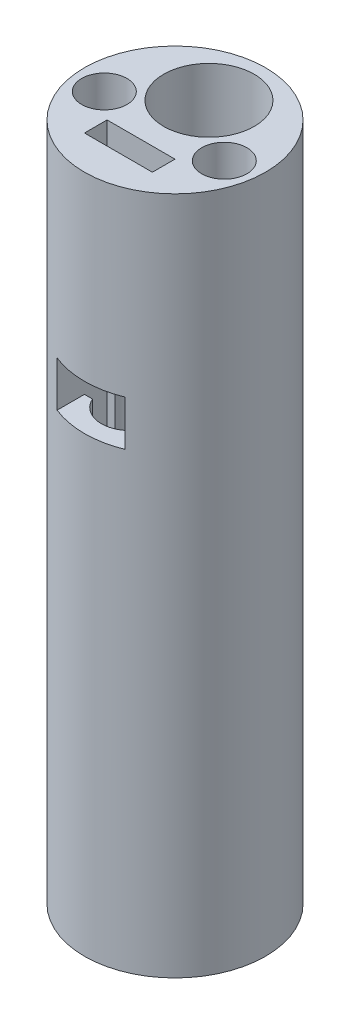
ISO-10303-21;
HEADER;
FILE_DESCRIPTION(('STEP AP214'),'2;1');
FILE_NAME('part.step','',(''),(''),'','','');
FILE_SCHEMA(('AUTOMOTIVE_DESIGN { 1 0 10303 214 1 1 1 1 }'));
ENDSEC;
DATA;
#1=APPLICATION_CONTEXT('core data for automotive mechanical design processes');
#2=APPLICATION_PROTOCOL_DEFINITION('international standard','automotive_design',2000,#1);
#3=PRODUCT_CONTEXT('',#1,'mechanical');
#4=PRODUCT('Part','Part','',(#3));
#5=PRODUCT_RELATED_PRODUCT_CATEGORY('part','',(#4));
#6=PRODUCT_DEFINITION_FORMATION('','',#4);
#7=PRODUCT_DEFINITION_CONTEXT('part definition',#1,'design');
#8=PRODUCT_DEFINITION('design','',#6,#7);
#9=PRODUCT_DEFINITION_SHAPE('','',#8);
#10=(LENGTH_UNIT() NAMED_UNIT(*) SI_UNIT(.MILLI.,.METRE.));
#11=(NAMED_UNIT(*) PLANE_ANGLE_UNIT() SI_UNIT($,.RADIAN.));
#12=(NAMED_UNIT(*) SI_UNIT($,.STERADIAN.) SOLID_ANGLE_UNIT());
#13=UNCERTAINTY_MEASURE_WITH_UNIT(LENGTH_MEASURE(1.E-05),#10,'distance_accuracy_value','');
#14=(GEOMETRIC_REPRESENTATION_CONTEXT(3) GLOBAL_UNCERTAINTY_ASSIGNED_CONTEXT((#13)) GLOBAL_UNIT_ASSIGNED_CONTEXT((#10,
#11,#12)) REPRESENTATION_CONTEXT('',''));
#15=CARTESIAN_POINT('',(0.,0.,0.));
#16=DIRECTION('',(0.,0.,1.));
#17=DIRECTION('',(1.,0.,0.));
#18=AXIS2_PLACEMENT_3D('',#15,#16,#17);
#19=CARTESIAN_POINT('',(0.,17.,0.));
#20=DIRECTION('',(0.,1.,0.));
#21=DIRECTION('',(0.,0.,1.));
#22=AXIS2_PLACEMENT_3D('',#19,#20,#21);
#23=PLANE('',#22);
#24=CARTESIAN_POINT('',(0.,17.,2.));
#25=DIRECTION('',(0.,1.,0.));
#26=DIRECTION('',(0.,0.,1.));
#27=AXIS2_PLACEMENT_3D('',#24,#25,#26);
#28=CIRCLE('',#27,1.25);
#29=CARTESIAN_POINT('',(1.14564392373896,17.,2.5));
#30=VERTEX_POINT('',#29);
#31=CARTESIAN_POINT('',(1.14564392373896,17.,1.5));
#32=VERTEX_POINT('',#31);
#33=EDGE_CURVE('E57',#30,#32,#28,.T.);
#34=ORIENTED_EDGE('',*,*,#33,.F.);
#35=DIRECTION('',(1.,0.,0.));
#36=VECTOR('',#35,1.);
#37=CARTESIAN_POINT('',(0.,17.,2.5));
#38=LINE('',#37,#36);
#39=CARTESIAN_POINT('',(1.5,17.,2.5));
#40=VERTEX_POINT('',#39);
#41=EDGE_CURVE('E180',#30,#40,#38,.T.);
#42=ORIENTED_EDGE('',*,*,#41,.T.);
#43=DIRECTION('',(0.,0.,-1.));
#44=VECTOR('',#43,1.);
#45=CARTESIAN_POINT('',(1.5,17.,0.));
#46=LINE('',#45,#44);
#47=CARTESIAN_POINT('',(1.5,17.,1.5));
#48=VERTEX_POINT('',#47);
#49=EDGE_CURVE('E202',#40,#48,#46,.T.);
#50=ORIENTED_EDGE('',*,*,#49,.T.);
#51=DIRECTION('',(1.,0.,0.));
#52=VECTOR('',#51,1.);
#53=CARTESIAN_POINT('',(0.,17.,1.5));
#54=LINE('',#53,#52);
#55=EDGE_CURVE('E181',#32,#48,#54,.T.);
#56=ORIENTED_EDGE('',*,*,#55,.F.);
#57=EDGE_LOOP('',(#34,#42,#50,#56));
#58=FACE_BOUND('',#57,.T.);
#59=ADVANCED_FACE('F45',(#58),#23,.T.);
#60=CARTESIAN_POINT('',(0.,20.,0.));
#61=DIRECTION('',(0.,-1.,0.));
#62=DIRECTION('',(0.,0.,-1.));
#63=AXIS2_PLACEMENT_3D('',#60,#61,#62);
#64=PLANE('',#63);
#65=DIRECTION('',(1.,0.,0.));
#66=VECTOR('',#65,1.);
#67=CARTESIAN_POINT('',(-1.5,20.,1.));
#68=LINE('',#67,#66);
#69=CARTESIAN_POINT('',(0.75,20.,1.));
#70=VERTEX_POINT('',#69);
#71=CARTESIAN_POINT('',(1.5,20.,1.));
#72=VERTEX_POINT('',#71);
#73=EDGE_CURVE('E268',#70,#72,#68,.T.);
#74=ORIENTED_EDGE('',*,*,#73,.F.);
#75=CARTESIAN_POINT('',(0.,20.,2.));
#76=DIRECTION('',(0.,1.,0.));
#77=DIRECTION('',(0.,0.,1.));
#78=AXIS2_PLACEMENT_3D('',#75,#76,#77);
#79=CIRCLE('',#78,1.25);
#80=CARTESIAN_POINT('',(1.14564392373896,20.,1.5));
#81=VERTEX_POINT('',#80);
#82=EDGE_CURVE('E65',#81,#70,#79,.T.);
#83=ORIENTED_EDGE('',*,*,#82,.F.);
#84=DIRECTION('',(1.,0.,0.));
#85=VECTOR('',#84,1.);
#86=CARTESIAN_POINT('',(0.,20.,1.5));
#87=LINE('',#86,#85);
#88=CARTESIAN_POINT('',(1.5,20.,1.5));
#89=VERTEX_POINT('',#88);
#90=EDGE_CURVE('E235',#81,#89,#87,.T.);
#91=ORIENTED_EDGE('',*,*,#90,.T.);
#92=DIRECTION('',(0.,0.,-1.));
#93=VECTOR('',#92,1.);
#94=CARTESIAN_POINT('',(1.5,20.,2.5));
#95=LINE('',#94,#93);
#96=EDGE_CURVE('E329',#89,#72,#95,.T.);
#97=ORIENTED_EDGE('',*,*,#96,.T.);
#98=EDGE_LOOP('',(#74,#83,#91,#97));
#99=FACE_BOUND('',#98,.T.);
#100=ADVANCED_FACE('F387',(#99),#64,.F.);
#101=CARTESIAN_POINT('',(1.5,20.,3.70809924354783));
#102=VERTEX_POINT('',#101);
#103=CARTESIAN_POINT('',(1.5,20.,2.5));
#104=VERTEX_POINT('',#103);
#105=EDGE_CURVE('E325',#102,#104,#95,.T.);
#106=ORIENTED_EDGE('',*,*,#105,.T.);
#107=DIRECTION('',(1.,0.,0.));
#108=VECTOR('',#107,1.);
#109=CARTESIAN_POINT('',(0.,20.,2.5));
#110=LINE('',#109,#108);
#111=CARTESIAN_POINT('',(1.14564392373896,20.,2.5));
#112=VERTEX_POINT('',#111);
#113=EDGE_CURVE('E232',#112,#104,#110,.T.);
#114=ORIENTED_EDGE('',*,*,#113,.F.);
#115=CARTESIAN_POINT('',(0.,20.,2.));
#116=DIRECTION('',(0.,1.,0.));
#117=DIRECTION('',(0.,0.,1.));
#118=AXIS2_PLACEMENT_3D('',#115,#116,#117);
#119=CIRCLE('',#118,1.25);
#120=CARTESIAN_POINT('',(-1.14564392373896,20.,2.5));
#121=VERTEX_POINT('',#120);
#122=EDGE_CURVE('E191',#121,#112,#119,.T.);
#123=ORIENTED_EDGE('',*,*,#122,.F.);
#124=DIRECTION('',(1.,0.,0.));
#125=VECTOR('',#124,1.);
#126=CARTESIAN_POINT('',(0.,20.,2.5));
#127=LINE('',#126,#125);
#128=CARTESIAN_POINT('',(-1.5,20.,2.5));
#129=VERTEX_POINT('',#128);
#130=EDGE_CURVE('E226',#129,#121,#127,.T.);
#131=ORIENTED_EDGE('',*,*,#130,.F.);
#132=DIRECTION('',(0.,0.,1.));
#133=VECTOR('',#132,1.);
#134=CARTESIAN_POINT('',(-1.5,20.,2.5));
#135=LINE('',#134,#133);
#136=CARTESIAN_POINT('',(-1.5,20.,3.70809924354783));
#137=VERTEX_POINT('',#136);
#138=EDGE_CURVE('E73',#129,#137,#135,.T.);
#139=ORIENTED_EDGE('',*,*,#138,.T.);
#140=CARTESIAN_POINT('',(0.,20.,0.));
#141=DIRECTION('',(0.,-1.,0.));
#142=DIRECTION('',(0.,0.,-1.));
#143=AXIS2_PLACEMENT_3D('',#140,#141,#142);
#144=CIRCLE('',#143,4.);
#145=EDGE_CURVE('E298',#102,#137,#144,.T.);
#146=ORIENTED_EDGE('',*,*,#145,.F.);
#147=EDGE_LOOP('',(#106,#114,#123,#131,#139,#146));
#148=FACE_BOUND('',#147,.T.);
#149=ADVANCED_FACE('F395',(#148),#64,.F.);
#150=CARTESIAN_POINT('',(0.,30.,0.));
#151=DIRECTION('',(0.,-1.,0.));
#152=DIRECTION('',(0.,0.,-1.));
#153=AXIS2_PLACEMENT_3D('',#150,#151,#152);
#154=CYLINDRICAL_SURFACE('',#153,4.);
#155=CARTESIAN_POINT('',(0.,22.,0.));
#156=DIRECTION('',(0.,1.,0.));
#157=DIRECTION('',(0.,0.,1.));
#158=AXIS2_PLACEMENT_3D('',#155,#156,#157);
#159=CIRCLE('',#158,4.);
#160=CARTESIAN_POINT('',(-1.5,22.,3.70809924354783));
#161=VERTEX_POINT('',#160);
#162=CARTESIAN_POINT('',(1.5,22.,3.70809924354783));
#163=VERTEX_POINT('',#162);
#164=EDGE_CURVE('E308',#161,#163,#159,.T.);
#165=ORIENTED_EDGE('',*,*,#164,.T.);
#166=DIRECTION('',(0.,-1.,0.));
#167=VECTOR('',#166,1.);
#168=CARTESIAN_POINT('',(1.5,30.,3.70809924354783));
#169=LINE('',#168,#167);
#170=EDGE_CURVE('E312',#163,#102,#169,.T.);
#171=ORIENTED_EDGE('',*,*,#170,.T.);
#172=ORIENTED_EDGE('',*,*,#145,.T.);
#173=DIRECTION('',(0.,-1.,0.));
#174=VECTOR('',#173,1.);
#175=CARTESIAN_POINT('',(-1.5,30.,3.70809924354783));
#176=LINE('',#175,#174);
#177=EDGE_CURVE('E304',#137,#161,#176,.F.);
#178=ORIENTED_EDGE('',*,*,#177,.T.);
#179=EDGE_LOOP('',(#165,#171,#172,#178));
#180=FACE_BOUND('',#179,.T.);
#181=CARTESIAN_POINT('',(0.,30.,0.));
#182=DIRECTION('',(0.,1.,0.));
#183=DIRECTION('',(0.,0.,1.));
#184=AXIS2_PLACEMENT_3D('',#181,#182,#183);
#185=CIRCLE('',#184,4.);
#186=CARTESIAN_POINT('',(0.,30.,4.));
#187=VERTEX_POINT('',#186);
#188=EDGE_CURVE('E55',#187,#187,#185,.T.);
#189=ORIENTED_EDGE('',*,*,#188,.F.);
#190=EDGE_LOOP('',(#189));
#191=FACE_BOUND('',#190,.T.);
#192=CARTESIAN_POINT('',(0.,0.,0.));
#193=DIRECTION('',(0.,1.,0.));
#194=DIRECTION('',(0.,0.,1.));
#195=AXIS2_PLACEMENT_3D('',#192,#193,#194);
#196=CIRCLE('',#195,4.);
#197=CARTESIAN_POINT('',(0.,0.,4.));
#198=VERTEX_POINT('',#197);
#199=EDGE_CURVE('E353',#198,#198,#196,.T.);
#200=ORIENTED_EDGE('',*,*,#199,.T.);
#201=EDGE_LOOP('',(#200));
#202=FACE_BOUND('',#201,.T.);
#203=ADVANCED_FACE('F47',(#180,#191,#202),#154,.T.);
#204=CARTESIAN_POINT('',(0.,30.,0.));
#205=DIRECTION('',(0.,1.,0.));
#206=DIRECTION('',(0.,0.,1.));
#207=AXIS2_PLACEMENT_3D('',#204,#205,#206);
#208=PLANE('',#207);
#209=CARTESIAN_POINT('',(-2.65,30.,0.472074698878716));
#210=DIRECTION('',(0.,1.,0.));
#211=DIRECTION('',(0.,0.,1.));
#212=AXIS2_PLACEMENT_3D('',#209,#210,#211);
#213=CIRCLE('',#212,1.);
#214=CARTESIAN_POINT('',(-2.65,30.,1.47207469887872));
#215=VERTEX_POINT('',#214);
#216=EDGE_CURVE('E461',#215,#215,#213,.T.);
#217=ORIENTED_EDGE('',*,*,#216,.F.);
#218=EDGE_LOOP('',(#217));
#219=FACE_BOUND('',#218,.T.);
#220=CARTESIAN_POINT('',(2.65,30.,0.472074698878716));
#221=DIRECTION('',(0.,1.,0.));
#222=DIRECTION('',(0.,0.,1.));
#223=AXIS2_PLACEMENT_3D('',#220,#221,#222);
#224=CIRCLE('',#223,1.);
#225=CARTESIAN_POINT('',(2.65,30.,1.47207469887872));
#226=VERTEX_POINT('',#225);
#227=EDGE_CURVE('E457',#226,#226,#224,.T.);
#228=ORIENTED_EDGE('',*,*,#227,.F.);
#229=EDGE_LOOP('',(#228));
#230=FACE_BOUND('',#229,.T.);
#231=CARTESIAN_POINT('',(0.,30.,-1.5));
#232=DIRECTION('',(0.,1.,0.));
#233=DIRECTION('',(0.,0.,1.));
#234=AXIS2_PLACEMENT_3D('',#231,#232,#233);
#235=CIRCLE('',#234,2.);
#236=CARTESIAN_POINT('',(0.,30.,0.5));
#237=VERTEX_POINT('',#236);
#238=EDGE_CURVE('E316',#237,#237,#235,.T.);
#239=ORIENTED_EDGE('',*,*,#238,.F.);
#240=EDGE_LOOP('',(#239));
#241=FACE_BOUND('',#240,.T.);
#242=DIRECTION('',(0.,0.,-1.));
#243=VECTOR('',#242,1.);
#244=CARTESIAN_POINT('',(1.5,30.,2.5));
#245=LINE('',#244,#243);
#246=CARTESIAN_POINT('',(1.5,30.,2.5));
#247=VERTEX_POINT('',#246);
#248=CARTESIAN_POINT('',(1.5,30.,1.5));
#249=VERTEX_POINT('',#248);
#250=EDGE_CURVE('E321',#247,#249,#245,.T.);
#251=ORIENTED_EDGE('',*,*,#250,.F.);
#252=DIRECTION('',(1.,0.,0.));
#253=VECTOR('',#252,1.);
#254=CARTESIAN_POINT('',(-1.5,30.,2.5));
#255=LINE('',#254,#253);
#256=CARTESIAN_POINT('',(-1.5,30.,2.5));
#257=VERTEX_POINT('',#256);
#258=EDGE_CURVE('E346',#257,#247,#255,.T.);
#259=ORIENTED_EDGE('',*,*,#258,.F.);
#260=DIRECTION('',(0.,0.,1.));
#261=VECTOR('',#260,1.);
#262=CARTESIAN_POINT('',(-1.5,30.,2.5));
#263=LINE('',#262,#261);
#264=CARTESIAN_POINT('',(-1.5,30.,1.5));
#265=VERTEX_POINT('',#264);
#266=EDGE_CURVE('E342',#265,#257,#263,.T.);
#267=ORIENTED_EDGE('',*,*,#266,.F.);
#268=DIRECTION('',(-1.,0.,0.));
#269=VECTOR('',#268,1.);
#270=CARTESIAN_POINT('',(-1.5,30.,1.5));
#271=LINE('',#270,#269);
#272=EDGE_CURVE('E338',#249,#265,#271,.T.);
#273=ORIENTED_EDGE('',*,*,#272,.F.);
#274=EDGE_LOOP('',(#251,#259,#267,#273));
#275=FACE_BOUND('',#274,.T.);
#276=ORIENTED_EDGE('',*,*,#188,.T.);
#277=EDGE_LOOP('',(#276));
#278=FACE_BOUND('',#277,.T.);
#279=ADVANCED_FACE('F372',(#219,#230,#241,#275,#278),#208,.T.);
#280=CARTESIAN_POINT('',(0.,0.,0.));
#281=DIRECTION('',(0.,1.,0.));
#282=DIRECTION('',(0.,0.,1.));
#283=AXIS2_PLACEMENT_3D('',#280,#281,#282);
#284=PLANE('',#283);
#285=CARTESIAN_POINT('',(-2.65,0.,0.472074698878716));
#286=DIRECTION('',(0.,1.,0.));
#287=DIRECTION('',(0.,0.,1.));
#288=AXIS2_PLACEMENT_3D('',#285,#286,#287);
#289=CIRCLE('',#288,1.);
#290=CARTESIAN_POINT('',(-2.65,0.,1.47207469887872));
#291=VERTEX_POINT('',#290);
#292=EDGE_CURVE('E452',#291,#291,#289,.T.);
#293=ORIENTED_EDGE('',*,*,#292,.T.);
#294=EDGE_LOOP('',(#293));
#295=FACE_BOUND('',#294,.T.);
#296=CARTESIAN_POINT('',(2.65,0.,0.472074698878716));
#297=DIRECTION('',(0.,1.,0.));
#298=DIRECTION('',(0.,0.,1.));
#299=AXIS2_PLACEMENT_3D('',#296,#297,#298);
#300=CIRCLE('',#299,1.);
#301=CARTESIAN_POINT('',(2.65,0.,1.47207469887872));
#302=VERTEX_POINT('',#301);
#303=EDGE_CURVE('E453',#302,#302,#300,.T.);
#304=ORIENTED_EDGE('',*,*,#303,.T.);
#305=EDGE_LOOP('',(#304));
#306=FACE_BOUND('',#305,.T.);
#307=CARTESIAN_POINT('',(0.,0.,2.));
#308=DIRECTION('',(0.,1.,0.));
#309=DIRECTION('',(0.,0.,1.));
#310=AXIS2_PLACEMENT_3D('',#307,#308,#309);
#311=CIRCLE('',#310,0.25);
#312=CARTESIAN_POINT('',(0.,0.,2.25));
#313=VERTEX_POINT('',#312);
#314=EDGE_CURVE('E49',#313,#313,#311,.T.);
#315=ORIENTED_EDGE('',*,*,#314,.T.);
#316=EDGE_LOOP('',(#315));
#317=FACE_BOUND('',#316,.T.);
#318=CARTESIAN_POINT('',(0.,0.,-1.5));
#319=DIRECTION('',(0.,1.,0.));
#320=DIRECTION('',(0.,0.,1.));
#321=AXIS2_PLACEMENT_3D('',#318,#319,#320);
#322=CIRCLE('',#321,2.);
#323=CARTESIAN_POINT('',(0.,0.,0.5));
#324=VERTEX_POINT('',#323);
#325=EDGE_CURVE('E317',#324,#324,#322,.T.);
#326=ORIENTED_EDGE('',*,*,#325,.T.);
#327=EDGE_LOOP('',(#326));
#328=FACE_BOUND('',#327,.T.);
#329=ORIENTED_EDGE('',*,*,#199,.F.);
#330=EDGE_LOOP('',(#329));
#331=FACE_BOUND('',#330,.T.);
#332=ADVANCED_FACE('F369',(#295,#306,#317,#328,#331),#284,.F.);
#333=CARTESIAN_POINT('',(1.5,20.,2.5));
#334=DIRECTION('',(1.,0.,0.));
#335=DIRECTION('',(0.,0.,-1.));
#336=AXIS2_PLACEMENT_3D('',#333,#334,#335);
#337=PLANE('',#336);
#338=ORIENTED_EDGE('',*,*,#250,.T.);
#339=DIRECTION('',(0.,1.,0.));
#340=VECTOR('',#339,1.);
#341=CARTESIAN_POINT('',(1.5,20.,1.5));
#342=LINE('',#341,#340);
#343=CARTESIAN_POINT('',(1.5,22.,1.5));
#344=VERTEX_POINT('',#343);
#345=EDGE_CURVE('E334',#344,#249,#342,.T.);
#346=ORIENTED_EDGE('',*,*,#345,.F.);
#347=DIRECTION('',(0.,0.,1.));
#348=VECTOR('',#347,1.);
#349=CARTESIAN_POINT('',(1.5,22.,1.));
#350=LINE('',#349,#348);
#351=CARTESIAN_POINT('',(1.5,22.,1.));
#352=VERTEX_POINT('',#351);
#353=EDGE_CURVE('E281',#352,#344,#350,.T.);
#354=ORIENTED_EDGE('',*,*,#353,.F.);
#355=DIRECTION('',(0.,1.,0.));
#356=VECTOR('',#355,1.);
#357=CARTESIAN_POINT('',(1.5,20.,1.));
#358=LINE('',#357,#356);
#359=EDGE_CURVE('E273',#72,#352,#358,.T.);
#360=ORIENTED_EDGE('',*,*,#359,.F.);
#361=ORIENTED_EDGE('',*,*,#96,.F.);
#362=DIRECTION('',(0.,1.,0.));
#363=VECTOR('',#362,1.);
#364=CARTESIAN_POINT('',(1.5,17.,1.5));
#365=LINE('',#364,#363);
#366=EDGE_CURVE('E249',#48,#89,#365,.T.);
#367=ORIENTED_EDGE('',*,*,#366,.F.);
#368=ORIENTED_EDGE('',*,*,#49,.F.);
#369=DIRECTION('',(0.,1.,0.));
#370=VECTOR('',#369,1.);
#371=CARTESIAN_POINT('',(1.5,17.,2.5));
#372=LINE('',#371,#370);
#373=EDGE_CURVE('E196',#40,#104,#372,.T.);
#374=ORIENTED_EDGE('',*,*,#373,.T.);
#375=ORIENTED_EDGE('',*,*,#105,.F.);
#376=ORIENTED_EDGE('',*,*,#170,.F.);
#377=DIRECTION('',(0.,0.,-1.));
#378=VECTOR('',#377,1.);
#379=CARTESIAN_POINT('',(1.5,22.,32.5));
#380=LINE('',#379,#378);
#381=CARTESIAN_POINT('',(1.5,22.,2.5));
#382=VERTEX_POINT('',#381);
#383=EDGE_CURVE('E295',#163,#382,#380,.T.);
#384=ORIENTED_EDGE('',*,*,#383,.T.);
#385=DIRECTION('',(0.,1.,0.));
#386=VECTOR('',#385,1.);
#387=CARTESIAN_POINT('',(1.5,20.,2.5));
#388=LINE('',#387,#386);
#389=EDGE_CURVE('E350',#382,#247,#388,.T.);
#390=ORIENTED_EDGE('',*,*,#389,.T.);
#391=EDGE_LOOP('',(#338,#346,#354,#360,#361,#367,#368,#374,#375,#376,#384,#390));
#392=FACE_BOUND('',#391,.T.);
#393=ADVANCED_FACE('F371',(#392),#337,.F.);
#394=CARTESIAN_POINT('',(-1.5,20.,2.5));
#395=DIRECTION('',(0.,0.,1.));
#396=DIRECTION('',(1.,0.,0.));
#397=AXIS2_PLACEMENT_3D('',#394,#395,#396);
#398=PLANE('',#397);
#399=ORIENTED_EDGE('',*,*,#389,.F.);
#400=DIRECTION('',(1.,0.,0.));
#401=VECTOR('',#400,1.);
#402=CARTESIAN_POINT('',(1.5,22.,2.5));
#403=LINE('',#402,#401);
#404=CARTESIAN_POINT('',(-1.5,22.,2.5));
#405=VERTEX_POINT('',#404);
#406=EDGE_CURVE('E288',#405,#382,#403,.T.);
#407=ORIENTED_EDGE('',*,*,#406,.F.);
#408=DIRECTION('',(0.,1.,0.));
#409=VECTOR('',#408,1.);
#410=CARTESIAN_POINT('',(-1.5,20.,2.5));
#411=LINE('',#410,#409);
#412=EDGE_CURVE('E354',#405,#257,#411,.T.);
#413=ORIENTED_EDGE('',*,*,#412,.T.);
#414=ORIENTED_EDGE('',*,*,#258,.T.);
#415=EDGE_LOOP('',(#399,#407,#413,#414));
#416=FACE_BOUND('',#415,.T.);
#417=ADVANCED_FACE('F379',(#416),#398,.F.);
#418=CARTESIAN_POINT('',(-1.5,20.,2.5));
#419=DIRECTION('',(-1.,0.,0.));
#420=DIRECTION('',(0.,0.,1.));
#421=AXIS2_PLACEMENT_3D('',#418,#419,#420);
#422=PLANE('',#421);
#423=ORIENTED_EDGE('',*,*,#266,.T.);
#424=ORIENTED_EDGE('',*,*,#412,.F.);
#425=DIRECTION('',(0.,0.,-1.));
#426=VECTOR('',#425,1.);
#427=CARTESIAN_POINT('',(-1.5,22.,32.5));
#428=LINE('',#427,#426);
#429=EDGE_CURVE('E294',#161,#405,#428,.T.);
#430=ORIENTED_EDGE('',*,*,#429,.F.);
#431=ORIENTED_EDGE('',*,*,#177,.F.);
#432=ORIENTED_EDGE('',*,*,#138,.F.);
#433=DIRECTION('',(0.,1.,0.));
#434=VECTOR('',#433,1.);
#435=CARTESIAN_POINT('',(-1.5,17.,2.5));
#436=LINE('',#435,#434);
#437=CARTESIAN_POINT('',(-1.5,17.,2.5));
#438=VERTEX_POINT('',#437);
#439=EDGE_CURVE('E256',#438,#129,#436,.T.);
#440=ORIENTED_EDGE('',*,*,#439,.F.);
#441=DIRECTION('',(0.,0.,1.));
#442=VECTOR('',#441,1.);
#443=CARTESIAN_POINT('',(-1.5,17.,0.));
#444=LINE('',#443,#442);
#445=CARTESIAN_POINT('',(-1.5,17.,1.5));
#446=VERTEX_POINT('',#445);
#447=EDGE_CURVE('E209',#446,#438,#444,.T.);
#448=ORIENTED_EDGE('',*,*,#447,.F.);
#449=DIRECTION('',(0.,1.,0.));
#450=VECTOR('',#449,1.);
#451=CARTESIAN_POINT('',(-1.5,17.,1.5));
#452=LINE('',#451,#450);
#453=CARTESIAN_POINT('',(-1.5,20.,1.5));
#454=VERTEX_POINT('',#453);
#455=EDGE_CURVE('E259',#446,#454,#452,.T.);
#456=ORIENTED_EDGE('',*,*,#455,.T.);
#457=CARTESIAN_POINT('',(-1.5,20.,1.));
#458=VERTEX_POINT('',#457);
#459=EDGE_CURVE('E330',#458,#454,#135,.T.);
#460=ORIENTED_EDGE('',*,*,#459,.F.);
#461=DIRECTION('',(0.,-1.,0.));
#462=VECTOR('',#461,1.);
#463=CARTESIAN_POINT('',(-1.5,20.,1.));
#464=LINE('',#463,#462);
#465=CARTESIAN_POINT('',(-1.5,22.,1.));
#466=VERTEX_POINT('',#465);
#467=EDGE_CURVE('E264',#466,#458,#464,.T.);
#468=ORIENTED_EDGE('',*,*,#467,.F.);
#469=DIRECTION('',(0.,0.,1.));
#470=VECTOR('',#469,1.);
#471=CARTESIAN_POINT('',(-1.5,22.,1.));
#472=LINE('',#471,#470);
#473=CARTESIAN_POINT('',(-1.5,22.,1.5));
#474=VERTEX_POINT('',#473);
#475=EDGE_CURVE('E285',#466,#474,#472,.T.);
#476=ORIENTED_EDGE('',*,*,#475,.T.);
#477=DIRECTION('',(0.,1.,0.));
#478=VECTOR('',#477,1.);
#479=CARTESIAN_POINT('',(-1.5,20.,1.5));
#480=LINE('',#479,#478);
#481=EDGE_CURVE('E357',#474,#265,#480,.T.);
#482=ORIENTED_EDGE('',*,*,#481,.T.);
#483=EDGE_LOOP('',(#423,#424,#430,#431,#432,#440,#448,#456,#460,#468,#476,#482));
#484=FACE_BOUND('',#483,.T.);
#485=ADVANCED_FACE('F434',(#484),#422,.F.);
#486=CARTESIAN_POINT('',(-1.5,20.,1.5));
#487=DIRECTION('',(0.,0.,-1.));
#488=DIRECTION('',(-1.,0.,0.));
#489=AXIS2_PLACEMENT_3D('',#486,#487,#488);
#490=PLANE('',#489);
#491=ORIENTED_EDGE('',*,*,#481,.F.);
#492=DIRECTION('',(-1.,0.,0.));
#493=VECTOR('',#492,1.);
#494=CARTESIAN_POINT('',(-1.5,22.,1.5));
#495=LINE('',#494,#493);
#496=EDGE_CURVE('E242',#344,#474,#495,.T.);
#497=ORIENTED_EDGE('',*,*,#496,.F.);
#498=ORIENTED_EDGE('',*,*,#345,.T.);
#499=ORIENTED_EDGE('',*,*,#272,.T.);
#500=EDGE_LOOP('',(#491,#497,#498,#499));
#501=FACE_BOUND('',#500,.T.);
#502=ADVANCED_FACE('F520',(#501),#490,.F.);
#503=DIRECTION('',(1.,0.,0.));
#504=VECTOR('',#503,1.);
#505=CARTESIAN_POINT('',(0.,20.,1.5));
#506=LINE('',#505,#504);
#507=CARTESIAN_POINT('',(-1.14564392373896,20.,1.5));
#508=VERTEX_POINT('',#507);
#509=EDGE_CURVE('E222',#454,#508,#506,.T.);
#510=ORIENTED_EDGE('',*,*,#509,.T.);
#511=CARTESIAN_POINT('',(-0.750000000000001,20.,1.));
#512=VERTEX_POINT('',#511);
#513=EDGE_CURVE('E219',#512,#508,#79,.T.);
#514=ORIENTED_EDGE('',*,*,#513,.F.);
#515=EDGE_CURVE('E269',#458,#512,#68,.T.);
#516=ORIENTED_EDGE('',*,*,#515,.F.);
#517=ORIENTED_EDGE('',*,*,#459,.T.);
#518=EDGE_LOOP('',(#510,#514,#516,#517));
#519=FACE_BOUND('',#518,.T.);
#520=ADVANCED_FACE('F398',(#519),#64,.F.);
#521=CARTESIAN_POINT('',(0.,0.,-1.5));
#522=DIRECTION('',(0.,1.,0.));
#523=DIRECTION('',(0.,0.,1.));
#524=AXIS2_PLACEMENT_3D('',#521,#522,#523);
#525=CYLINDRICAL_SURFACE('',#524,2.);
#526=ORIENTED_EDGE('',*,*,#325,.F.);
#527=EDGE_LOOP('',(#526));
#528=FACE_BOUND('',#527,.T.);
#529=ORIENTED_EDGE('',*,*,#238,.T.);
#530=EDGE_LOOP('',(#529));
#531=FACE_BOUND('',#530,.T.);
#532=ADVANCED_FACE('F527',(#528,#531),#525,.F.);
#533=CARTESIAN_POINT('',(1.5,22.,32.5));
#534=DIRECTION('',(0.,1.,0.));
#535=DIRECTION('',(0.,0.,1.));
#536=AXIS2_PLACEMENT_3D('',#533,#534,#535);
#537=PLANE('',#536);
#538=ORIENTED_EDGE('',*,*,#429,.T.);
#539=ORIENTED_EDGE('',*,*,#406,.T.);
#540=ORIENTED_EDGE('',*,*,#383,.F.);
#541=ORIENTED_EDGE('',*,*,#164,.F.);
#542=EDGE_LOOP('',(#538,#539,#540,#541));
#543=FACE_BOUND('',#542,.T.);
#544=ADVANCED_FACE('F495',(#543),#537,.F.);
#545=CARTESIAN_POINT('',(-1.5,22.,1.));
#546=DIRECTION('',(0.,1.,0.));
#547=DIRECTION('',(0.,0.,1.));
#548=AXIS2_PLACEMENT_3D('',#545,#546,#547);
#549=PLANE('',#548);
#550=ORIENTED_EDGE('',*,*,#496,.T.);
#551=ORIENTED_EDGE('',*,*,#475,.F.);
#552=DIRECTION('',(-1.,0.,0.));
#553=VECTOR('',#552,1.);
#554=CARTESIAN_POINT('',(-1.5,22.,1.));
#555=LINE('',#554,#553);
#556=EDGE_CURVE('E277',#352,#466,#555,.T.);
#557=ORIENTED_EDGE('',*,*,#556,.F.);
#558=ORIENTED_EDGE('',*,*,#353,.T.);
#559=EDGE_LOOP('',(#550,#551,#557,#558));
#560=FACE_BOUND('',#559,.T.);
#561=ADVANCED_FACE('F517',(#560),#549,.F.);
#562=CARTESIAN_POINT('',(0.,0.,1.));
#563=DIRECTION('',(0.,0.,-1.));
#564=DIRECTION('',(-1.,0.,0.));
#565=AXIS2_PLACEMENT_3D('',#562,#563,#564);
#566=PLANE('',#565);
#567=ORIENTED_EDGE('',*,*,#467,.T.);
#568=ORIENTED_EDGE('',*,*,#515,.T.);
#569=DIRECTION('',(0.,1.,0.));
#570=VECTOR('',#569,1.);
#571=CARTESIAN_POINT('',(-0.750000000000001,17.,1.));
#572=LINE('',#571,#570);
#573=CARTESIAN_POINT('',(-0.750000000000001,17.,1.));
#574=VERTEX_POINT('',#573);
#575=EDGE_CURVE('E239',#574,#512,#572,.T.);
#576=ORIENTED_EDGE('',*,*,#575,.F.);
#577=DIRECTION('',(-1.,0.,0.));
#578=VECTOR('',#577,1.);
#579=CARTESIAN_POINT('',(0.,17.,1.));
#580=LINE('',#579,#578);
#581=CARTESIAN_POINT('',(0.750000000000001,17.,1.));
#582=VERTEX_POINT('',#581);
#583=EDGE_CURVE('E215',#582,#574,#580,.T.);
#584=ORIENTED_EDGE('',*,*,#583,.F.);
#585=DIRECTION('',(0.,1.,0.));
#586=VECTOR('',#585,1.);
#587=CARTESIAN_POINT('',(0.750000000000001,17.,1.));
#588=LINE('',#587,#586);
#589=EDGE_CURVE('E243',#582,#70,#588,.T.);
#590=ORIENTED_EDGE('',*,*,#589,.T.);
#591=ORIENTED_EDGE('',*,*,#73,.T.);
#592=ORIENTED_EDGE('',*,*,#359,.T.);
#593=ORIENTED_EDGE('',*,*,#556,.T.);
#594=EDGE_LOOP('',(#567,#568,#576,#584,#590,#591,#592,#593));
#595=FACE_BOUND('',#594,.T.);
#596=ADVANCED_FACE('F510',(#595),#566,.F.);
#597=CARTESIAN_POINT('',(0.,17.,2.));
#598=DIRECTION('',(0.,1.,0.));
#599=DIRECTION('',(0.,0.,1.));
#600=AXIS2_PLACEMENT_3D('',#597,#598,#599);
#601=CYLINDRICAL_SURFACE('',#600,1.25);
#602=ORIENTED_EDGE('',*,*,#513,.T.);
#603=DIRECTION('',(0.,1.,0.));
#604=VECTOR('',#603,1.);
#605=CARTESIAN_POINT('',(-1.14564392373896,17.,1.5));
#606=LINE('',#605,#604);
#607=CARTESIAN_POINT('',(-1.14564392373896,17.,1.5));
#608=VERTEX_POINT('',#607);
#609=EDGE_CURVE('E218',#608,#508,#606,.T.);
#610=ORIENTED_EDGE('',*,*,#609,.F.);
#611=CARTESIAN_POINT('',(-1.14564392373896,17.,2.5));
#612=VERTEX_POINT('',#611);
#613=EDGE_CURVE('E11',#608,#612,#28,.T.);
#614=ORIENTED_EDGE('',*,*,#613,.T.);
#615=DIRECTION('',(0.,1.,0.));
#616=VECTOR('',#615,1.);
#617=CARTESIAN_POINT('',(-1.14564392373896,17.,2.5));
#618=LINE('',#617,#616);
#619=EDGE_CURVE('E197',#612,#121,#618,.T.);
#620=ORIENTED_EDGE('',*,*,#619,.T.);
#621=ORIENTED_EDGE('',*,*,#122,.T.);
#622=DIRECTION('',(0.,1.,0.));
#623=VECTOR('',#622,1.);
#624=CARTESIAN_POINT('',(1.14564392373896,17.,2.5));
#625=LINE('',#624,#623);
#626=EDGE_CURVE('E186',#30,#112,#625,.T.);
#627=ORIENTED_EDGE('',*,*,#626,.F.);
#628=ORIENTED_EDGE('',*,*,#33,.T.);
#629=DIRECTION('',(0.,1.,0.));
#630=VECTOR('',#629,1.);
#631=CARTESIAN_POINT('',(1.14564392373896,17.,1.5));
#632=LINE('',#631,#630);
#633=EDGE_CURVE('E246',#32,#81,#632,.T.);
#634=ORIENTED_EDGE('',*,*,#633,.T.);
#635=ORIENTED_EDGE('',*,*,#82,.T.);
#636=ORIENTED_EDGE('',*,*,#589,.F.);
#637=EDGE_CURVE('E58',#582,#574,#28,.T.);
#638=ORIENTED_EDGE('',*,*,#637,.T.);
#639=ORIENTED_EDGE('',*,*,#575,.T.);
#640=EDGE_LOOP('',(#602,#610,#614,#620,#621,#627,#628,#634,#635,#636,#638,#639));
#641=FACE_BOUND('',#640,.T.);
#642=CARTESIAN_POINT('',(0.,14.,2.));
#643=DIRECTION('',(0.,1.,0.));
#644=DIRECTION('',(0.,0.,1.));
#645=AXIS2_PLACEMENT_3D('',#642,#643,#644);
#646=CIRCLE('',#645,1.25);
#647=CARTESIAN_POINT('',(0.,14.,3.25));
#648=VERTEX_POINT('',#647);
#649=EDGE_CURVE('E184',#648,#648,#646,.T.);
#650=ORIENTED_EDGE('',*,*,#649,.F.);
#651=EDGE_LOOP('',(#650));
#652=FACE_BOUND('',#651,.T.);
#653=ADVANCED_FACE('F188',(#641,#652),#601,.F.);
#654=CARTESIAN_POINT('',(0.,17.,1.5));
#655=DIRECTION('',(0.,0.,1.));
#656=DIRECTION('',(1.,0.,0.));
#657=AXIS2_PLACEMENT_3D('',#654,#655,#656);
#658=PLANE('',#657);
#659=ORIENTED_EDGE('',*,*,#90,.F.);
#660=ORIENTED_EDGE('',*,*,#633,.F.);
#661=ORIENTED_EDGE('',*,*,#55,.T.);
#662=ORIENTED_EDGE('',*,*,#366,.T.);
#663=EDGE_LOOP('',(#659,#660,#661,#662));
#664=FACE_BOUND('',#663,.T.);
#665=ADVANCED_FACE('F541',(#664),#658,.T.);
#666=CARTESIAN_POINT('',(0.,17.,2.5));
#667=DIRECTION('',(0.,0.,1.));
#668=DIRECTION('',(1.,0.,0.));
#669=AXIS2_PLACEMENT_3D('',#666,#667,#668);
#670=PLANE('',#669);
#671=ORIENTED_EDGE('',*,*,#113,.T.);
#672=ORIENTED_EDGE('',*,*,#373,.F.);
#673=ORIENTED_EDGE('',*,*,#41,.F.);
#674=ORIENTED_EDGE('',*,*,#626,.T.);
#675=EDGE_LOOP('',(#671,#672,#673,#674));
#676=FACE_BOUND('',#675,.T.);
#677=ADVANCED_FACE('F199',(#676),#670,.F.);
#678=CARTESIAN_POINT('',(0.,17.,2.5));
#679=DIRECTION('',(0.,0.,1.));
#680=DIRECTION('',(1.,0.,0.));
#681=AXIS2_PLACEMENT_3D('',#678,#679,#680);
#682=PLANE('',#681);
#683=ORIENTED_EDGE('',*,*,#130,.T.);
#684=ORIENTED_EDGE('',*,*,#619,.F.);
#685=DIRECTION('',(1.,0.,0.));
#686=VECTOR('',#685,1.);
#687=CARTESIAN_POINT('',(0.,17.,2.5));
#688=LINE('',#687,#686);
#689=EDGE_CURVE('E203',#438,#612,#688,.T.);
#690=ORIENTED_EDGE('',*,*,#689,.F.);
#691=ORIENTED_EDGE('',*,*,#439,.T.);
#692=EDGE_LOOP('',(#683,#684,#690,#691));
#693=FACE_BOUND('',#692,.T.);
#694=ADVANCED_FACE('F413',(#693),#682,.F.);
#695=CARTESIAN_POINT('',(0.,17.,1.5));
#696=DIRECTION('',(0.,0.,1.));
#697=DIRECTION('',(1.,0.,0.));
#698=AXIS2_PLACEMENT_3D('',#695,#696,#697);
#699=PLANE('',#698);
#700=ORIENTED_EDGE('',*,*,#509,.F.);
#701=ORIENTED_EDGE('',*,*,#455,.F.);
#702=DIRECTION('',(1.,0.,0.));
#703=VECTOR('',#702,1.);
#704=CARTESIAN_POINT('',(0.,17.,1.5));
#705=LINE('',#704,#703);
#706=EDGE_CURVE('E419',#446,#608,#705,.T.);
#707=ORIENTED_EDGE('',*,*,#706,.T.);
#708=ORIENTED_EDGE('',*,*,#609,.T.);
#709=EDGE_LOOP('',(#700,#701,#707,#708));
#710=FACE_BOUND('',#709,.T.);
#711=ADVANCED_FACE('F403',(#710),#699,.T.);
#712=ORIENTED_EDGE('',*,*,#613,.F.);
#713=ORIENTED_EDGE('',*,*,#706,.F.);
#714=ORIENTED_EDGE('',*,*,#447,.T.);
#715=ORIENTED_EDGE('',*,*,#689,.T.);
#716=EDGE_LOOP('',(#712,#713,#714,#715));
#717=FACE_BOUND('',#716,.T.);
#718=ADVANCED_FACE('F389',(#717),#23,.T.);
#719=CARTESIAN_POINT('',(0.,14.,2.));
#720=DIRECTION('',(0.,1.,0.));
#721=DIRECTION('',(0.,0.,1.));
#722=AXIS2_PLACEMENT_3D('',#719,#720,#721);
#723=PLANE('',#722);
#724=CARTESIAN_POINT('',(0.,14.,2.));
#725=DIRECTION('',(0.,1.,0.));
#726=DIRECTION('',(0.,0.,1.));
#727=AXIS2_PLACEMENT_3D('',#724,#725,#726);
#728=CIRCLE('',#727,0.5);
#729=CARTESIAN_POINT('',(0.,14.,2.5));
#730=VERTEX_POINT('',#729);
#731=EDGE_CURVE('E440',#730,#730,#728,.T.);
#732=ORIENTED_EDGE('',*,*,#731,.F.);
#733=EDGE_LOOP('',(#732));
#734=FACE_BOUND('',#733,.T.);
#735=ORIENTED_EDGE('',*,*,#649,.T.);
#736=EDGE_LOOP('',(#735));
#737=FACE_BOUND('',#736,.T.);
#738=ADVANCED_FACE('F402',(#734,#737),#723,.T.);
#739=CARTESIAN_POINT('',(0.,17.,2.));
#740=DIRECTION('',(0.,1.,0.));
#741=DIRECTION('',(0.,0.,1.));
#742=AXIS2_PLACEMENT_3D('',#739,#740,#741);
#743=PLANE('',#742);
#744=ORIENTED_EDGE('',*,*,#583,.T.);
#745=ORIENTED_EDGE('',*,*,#637,.F.);
#746=EDGE_LOOP('',(#744,#745));
#747=FACE_BOUND('',#746,.T.);
#748=ADVANCED_FACE('F410',(#747),#743,.F.);
#749=CARTESIAN_POINT('',(0.,0.499999999999999,2.));
#750=DIRECTION('',(0.,1.,0.));
#751=DIRECTION('',(0.,0.,1.));
#752=AXIS2_PLACEMENT_3D('',#749,#750,#751);
#753=CYLINDRICAL_SURFACE('',#752,0.5);
#754=CARTESIAN_POINT('',(0.,0.499999999999999,2.));
#755=DIRECTION('',(0.,1.,0.));
#756=DIRECTION('',(0.,0.,1.));
#757=AXIS2_PLACEMENT_3D('',#754,#755,#756);
#758=CIRCLE('',#757,0.5);
#759=CARTESIAN_POINT('',(0.,0.499999999999999,2.5));
#760=VERTEX_POINT('',#759);
#761=EDGE_CURVE('E444',#760,#760,#758,.T.);
#762=ORIENTED_EDGE('',*,*,#761,.F.);
#763=EDGE_LOOP('',(#762));
#764=FACE_BOUND('',#763,.T.);
#765=ORIENTED_EDGE('',*,*,#731,.T.);
#766=EDGE_LOOP('',(#765));
#767=FACE_BOUND('',#766,.T.);
#768=ADVANCED_FACE('F747',(#764,#767),#753,.F.);
#769=CARTESIAN_POINT('',(0.,0.499999999999999,2.));
#770=DIRECTION('',(0.,1.,0.));
#771=DIRECTION('',(0.,0.,1.));
#772=AXIS2_PLACEMENT_3D('',#769,#770,#771);
#773=PLANE('',#772);
#774=CARTESIAN_POINT('',(0.,0.499999999999999,2.));
#775=DIRECTION('',(0.,1.,0.));
#776=DIRECTION('',(0.,0.,1.));
#777=AXIS2_PLACEMENT_3D('',#774,#775,#776);
#778=CIRCLE('',#777,0.25);
#779=CARTESIAN_POINT('',(0.,0.499999999999999,2.25));
#780=VERTEX_POINT('',#779);
#781=EDGE_CURVE('E448',#780,#780,#778,.T.);
#782=ORIENTED_EDGE('',*,*,#781,.F.);
#783=EDGE_LOOP('',(#782));
#784=FACE_BOUND('',#783,.T.);
#785=ORIENTED_EDGE('',*,*,#761,.T.);
#786=EDGE_LOOP('',(#785));
#787=FACE_BOUND('',#786,.T.);
#788=ADVANCED_FACE('F737',(#784,#787),#773,.T.);
#789=CARTESIAN_POINT('',(0.,-29.5,2.));
#790=DIRECTION('',(0.,1.,0.));
#791=DIRECTION('',(0.,0.,1.));
#792=AXIS2_PLACEMENT_3D('',#789,#790,#791);
#793=CYLINDRICAL_SURFACE('',#792,0.25);
#794=ORIENTED_EDGE('',*,*,#781,.T.);
#795=EDGE_LOOP('',(#794));
#796=FACE_BOUND('',#795,.T.);
#797=ORIENTED_EDGE('',*,*,#314,.F.);
#798=EDGE_LOOP('',(#797));
#799=FACE_BOUND('',#798,.T.);
#800=ADVANCED_FACE('F733',(#796,#799),#793,.F.);
#801=CARTESIAN_POINT('',(2.65,0.,0.472074698878716));
#802=DIRECTION('',(0.,1.,0.));
#803=DIRECTION('',(0.,0.,1.));
#804=AXIS2_PLACEMENT_3D('',#801,#802,#803);
#805=CYLINDRICAL_SURFACE('',#804,1.);
#806=ORIENTED_EDGE('',*,*,#303,.F.);
#807=EDGE_LOOP('',(#806));
#808=FACE_BOUND('',#807,.T.);
#809=ORIENTED_EDGE('',*,*,#227,.T.);
#810=EDGE_LOOP('',(#809));
#811=FACE_BOUND('',#810,.T.);
#812=ADVANCED_FACE('F471',(#808,#811),#805,.F.);
#813=CARTESIAN_POINT('',(-2.65,0.,0.472074698878716));
#814=DIRECTION('',(0.,1.,0.));
#815=DIRECTION('',(0.,0.,1.));
#816=AXIS2_PLACEMENT_3D('',#813,#814,#815);
#817=CYLINDRICAL_SURFACE('',#816,1.);
#818=ORIENTED_EDGE('',*,*,#292,.F.);
#819=EDGE_LOOP('',(#818));
#820=FACE_BOUND('',#819,.T.);
#821=ORIENTED_EDGE('',*,*,#216,.T.);
#822=EDGE_LOOP('',(#821));
#823=FACE_BOUND('',#822,.T.);
#824=ADVANCED_FACE('F468',(#820,#823),#817,.F.);
#825=CLOSED_SHELL('',(#59,#100,#149,#203,#279,#332,#393,#417,#485,#502,#520,#532,#544,#561,#596,
#653,#665,#677,#694,#711,#718,#738,#748,#768,#788,#800,#812,#824));
#826=MANIFOLD_SOLID_BREP('B2',#825);
#827=ADVANCED_BREP_SHAPE_REPRESENTATION('',(#18,#826),#14);
#828=SHAPE_DEFINITION_REPRESENTATION(#9,#827);
ENDSEC;
END-ISO-10303-21;
